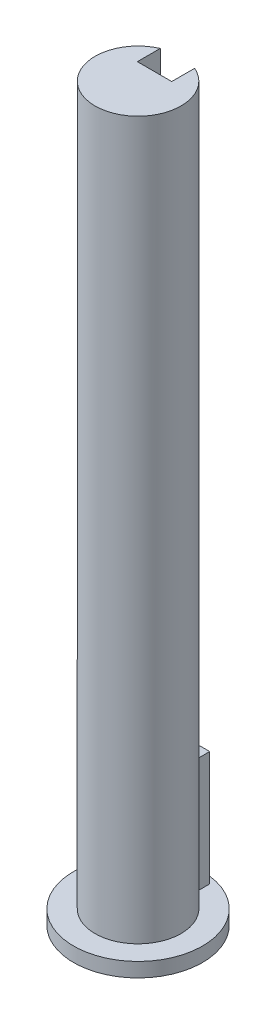
ISO-10303-21;
HEADER;
FILE_DESCRIPTION(('STEP AP214'),'2;1');
FILE_NAME('part.step','',(''),(''),'','','');
FILE_SCHEMA(('AUTOMOTIVE_DESIGN { 1 0 10303 214 1 1 1 1 }'));
ENDSEC;
DATA;
#1=APPLICATION_CONTEXT('core data for automotive mechanical design processes');
#2=APPLICATION_PROTOCOL_DEFINITION('international standard','automotive_design',2000,#1);
#3=PRODUCT_CONTEXT('',#1,'mechanical');
#4=PRODUCT('Part','Part','',(#3));
#5=PRODUCT_RELATED_PRODUCT_CATEGORY('part','',(#4));
#6=PRODUCT_DEFINITION_FORMATION('','',#4);
#7=PRODUCT_DEFINITION_CONTEXT('part definition',#1,'design');
#8=PRODUCT_DEFINITION('design','',#6,#7);
#9=PRODUCT_DEFINITION_SHAPE('','',#8);
#10=(LENGTH_UNIT() NAMED_UNIT(*) SI_UNIT(.MILLI.,.METRE.));
#11=(NAMED_UNIT(*) PLANE_ANGLE_UNIT() SI_UNIT($,.RADIAN.));
#12=(NAMED_UNIT(*) SI_UNIT($,.STERADIAN.) SOLID_ANGLE_UNIT());
#13=UNCERTAINTY_MEASURE_WITH_UNIT(LENGTH_MEASURE(1.E-05),#10,'distance_accuracy_value','');
#14=(GEOMETRIC_REPRESENTATION_CONTEXT(3) GLOBAL_UNCERTAINTY_ASSIGNED_CONTEXT((#13)) GLOBAL_UNIT_ASSIGNED_CONTEXT((#10,
#11,#12)) REPRESENTATION_CONTEXT('',''));
#15=CARTESIAN_POINT('',(0.,0.,0.));
#16=DIRECTION('',(0.,0.,1.));
#17=DIRECTION('',(1.,0.,0.));
#18=AXIS2_PLACEMENT_3D('',#15,#16,#17);
#19=CARTESIAN_POINT('',(0.,50.,0.));
#20=DIRECTION('',(0.,-1.,0.));
#21=DIRECTION('',(0.,0.,-1.));
#22=AXIS2_PLACEMENT_3D('',#19,#20,#21);
#23=CYLINDRICAL_SURFACE('',#22,3.);
#24=CARTESIAN_POINT('',(0.,50.,0.));
#25=DIRECTION('',(0.,1.,0.));
#26=DIRECTION('',(0.,0.,1.));
#27=AXIS2_PLACEMENT_3D('',#24,#25,#26);
#28=CIRCLE('',#27,3.);
#29=CARTESIAN_POINT('',(-1.2,50.,-2.7495454169735));
#30=VERTEX_POINT('',#29);
#31=CARTESIAN_POINT('',(1.2,50.,-2.7495454169735));
#32=VERTEX_POINT('',#31);
#33=EDGE_CURVE('E42',#30,#32,#28,.T.);
#34=ORIENTED_EDGE('',*,*,#33,.F.);
#35=DIRECTION('',(0.,1.,0.));
#36=VECTOR('',#35,1.);
#37=CARTESIAN_POINT('',(-1.2,24.,-2.7495454169735));
#38=LINE('',#37,#36);
#39=CARTESIAN_POINT('',(-1.2,24.,-2.7495454169735));
#40=VERTEX_POINT('',#39);
#41=EDGE_CURVE('E138',#40,#30,#38,.T.);
#42=ORIENTED_EDGE('',*,*,#41,.F.);
#43=CARTESIAN_POINT('',(0.,24.,0.));
#44=DIRECTION('',(0.,-1.,0.));
#45=DIRECTION('',(0.,0.,-1.));
#46=AXIS2_PLACEMENT_3D('',#43,#44,#45);
#47=CIRCLE('',#46,3.);
#48=CARTESIAN_POINT('',(1.2,24.,-2.7495454169735));
#49=VERTEX_POINT('',#48);
#50=EDGE_CURVE('E11',#40,#49,#47,.T.);
#51=ORIENTED_EDGE('',*,*,#50,.T.);
#52=DIRECTION('',(0.,1.,0.));
#53=VECTOR('',#52,1.);
#54=CARTESIAN_POINT('',(1.2,24.,-2.7495454169735));
#55=LINE('',#54,#53);
#56=EDGE_CURVE('E139',#49,#32,#55,.T.);
#57=ORIENTED_EDGE('',*,*,#56,.T.);
#58=EDGE_LOOP('',(#34,#42,#51,#57));
#59=FACE_BOUND('',#58,.T.);
#60=CARTESIAN_POINT('',(0.,0.,0.));
#61=DIRECTION('',(0.,1.,0.));
#62=DIRECTION('',(0.,0.,1.));
#63=AXIS2_PLACEMENT_3D('',#60,#61,#62);
#64=CIRCLE('',#63,3.);
#65=CARTESIAN_POINT('',(-1.,0.,-2.82842712474619));
#66=VERTEX_POINT('',#65);
#67=CARTESIAN_POINT('',(1.,0.,-2.82842712474619));
#68=VERTEX_POINT('',#67);
#69=EDGE_CURVE('E122',#66,#68,#64,.T.);
#70=ORIENTED_EDGE('',*,*,#69,.T.);
#71=DIRECTION('',(0.,-1.,0.));
#72=VECTOR('',#71,1.);
#73=CARTESIAN_POINT('',(1.,8.,-2.82842712474619));
#74=LINE('',#73,#72);
#75=CARTESIAN_POINT('',(1.,8.,-2.82842712474619));
#76=VERTEX_POINT('',#75);
#77=EDGE_CURVE('E130',#76,#68,#74,.T.);
#78=ORIENTED_EDGE('',*,*,#77,.F.);
#79=CARTESIAN_POINT('',(0.,8.,0.));
#80=DIRECTION('',(0.,1.,0.));
#81=DIRECTION('',(0.,0.,1.));
#82=AXIS2_PLACEMENT_3D('',#79,#80,#81);
#83=CIRCLE('',#82,3.);
#84=CARTESIAN_POINT('',(-1.,8.,-2.82842712474619));
#85=VERTEX_POINT('',#84);
#86=EDGE_CURVE('E57',#76,#85,#83,.T.);
#87=ORIENTED_EDGE('',*,*,#86,.T.);
#88=DIRECTION('',(0.,-1.,0.));
#89=VECTOR('',#88,1.);
#90=CARTESIAN_POINT('',(-1.,8.,-2.82842712474619));
#91=LINE('',#90,#89);
#92=EDGE_CURVE('E119',#85,#66,#91,.T.);
#93=ORIENTED_EDGE('',*,*,#92,.T.);
#94=EDGE_LOOP('',(#70,#78,#87,#93));
#95=FACE_BOUND('',#94,.T.);
#96=ADVANCED_FACE('F35',(#59,#95),#23,.T.);
#97=CARTESIAN_POINT('',(0.,50.,0.));
#98=DIRECTION('',(0.,1.,0.));
#99=DIRECTION('',(0.,0.,1.));
#100=AXIS2_PLACEMENT_3D('',#97,#98,#99);
#101=PLANE('',#100);
#102=DIRECTION('',(0.,0.,1.));
#103=VECTOR('',#102,1.);
#104=CARTESIAN_POINT('',(-1.2,50.,-1.1495454169735));
#105=LINE('',#104,#103);
#106=CARTESIAN_POINT('',(-1.2,50.,-1.1495454169735));
#107=VERTEX_POINT('',#106);
#108=EDGE_CURVE('E49',#30,#107,#105,.T.);
#109=ORIENTED_EDGE('',*,*,#108,.F.);
#110=ORIENTED_EDGE('',*,*,#33,.T.);
#111=DIRECTION('',(0.,0.,-1.));
#112=VECTOR('',#111,1.);
#113=CARTESIAN_POINT('',(1.2,50.,-1.1495454169735));
#114=LINE('',#113,#112);
#115=CARTESIAN_POINT('',(1.2,50.,-1.1495454169735));
#116=VERTEX_POINT('',#115);
#117=EDGE_CURVE('E153',#116,#32,#114,.T.);
#118=ORIENTED_EDGE('',*,*,#117,.F.);
#119=DIRECTION('',(1.,0.,0.));
#120=VECTOR('',#119,1.);
#121=CARTESIAN_POINT('',(-1.2,50.,-1.1495454169735));
#122=LINE('',#121,#120);
#123=EDGE_CURVE('E156',#107,#116,#122,.T.);
#124=ORIENTED_EDGE('',*,*,#123,.F.);
#125=EDGE_LOOP('',(#109,#110,#118,#124));
#126=FACE_BOUND('',#125,.T.);
#127=ADVANCED_FACE('F193',(#126),#101,.T.);
#128=CARTESIAN_POINT('',(0.999999999999999,8.,0.));
#129=DIRECTION('',(1.,0.,0.));
#130=DIRECTION('',(0.,0.,-1.));
#131=AXIS2_PLACEMENT_3D('',#128,#129,#130);
#132=PLANE('',#131);
#133=DIRECTION('',(0.,0.,1.));
#134=VECTOR('',#133,1.);
#135=CARTESIAN_POINT('',(0.999999999999999,0.,0.));
#136=LINE('',#135,#134);
#137=CARTESIAN_POINT('',(1.,0.,-4.));
#138=VERTEX_POINT('',#137);
#139=EDGE_CURVE('E110',#138,#68,#136,.T.);
#140=ORIENTED_EDGE('',*,*,#139,.F.);
#141=DIRECTION('',(0.,-1.,0.));
#142=VECTOR('',#141,1.);
#143=CARTESIAN_POINT('',(1.,8.,-4.));
#144=LINE('',#143,#142);
#145=CARTESIAN_POINT('',(1.,8.,-4.));
#146=VERTEX_POINT('',#145);
#147=EDGE_CURVE('E104',#146,#138,#144,.T.);
#148=ORIENTED_EDGE('',*,*,#147,.F.);
#149=DIRECTION('',(0.,0.,1.));
#150=VECTOR('',#149,1.);
#151=CARTESIAN_POINT('',(0.999999999999999,8.,0.));
#152=LINE('',#151,#150);
#153=EDGE_CURVE('E124',#146,#76,#152,.T.);
#154=ORIENTED_EDGE('',*,*,#153,.T.);
#155=ORIENTED_EDGE('',*,*,#77,.T.);
#156=EDGE_LOOP('',(#140,#148,#154,#155));
#157=FACE_BOUND('',#156,.T.);
#158=ADVANCED_FACE('F136',(#157),#132,.T.);
#159=CARTESIAN_POINT('',(0.,8.,-4.));
#160=DIRECTION('',(0.,0.,-1.));
#161=DIRECTION('',(-1.,0.,0.));
#162=AXIS2_PLACEMENT_3D('',#159,#160,#161);
#163=PLANE('',#162);
#164=DIRECTION('',(1.,0.,0.));
#165=VECTOR('',#164,1.);
#166=CARTESIAN_POINT('',(0.,0.,-4.));
#167=LINE('',#166,#165);
#168=CARTESIAN_POINT('',(-1.,0.,-4.));
#169=VERTEX_POINT('',#168);
#170=EDGE_CURVE('E98',#169,#138,#167,.T.);
#171=ORIENTED_EDGE('',*,*,#170,.F.);
#172=DIRECTION('',(0.,-1.,0.));
#173=VECTOR('',#172,1.);
#174=CARTESIAN_POINT('',(-1.,8.,-4.));
#175=LINE('',#174,#173);
#176=CARTESIAN_POINT('',(-1.,8.,-4.));
#177=VERTEX_POINT('',#176);
#178=EDGE_CURVE('E102',#177,#169,#175,.T.);
#179=ORIENTED_EDGE('',*,*,#178,.F.);
#180=DIRECTION('',(1.,0.,0.));
#181=VECTOR('',#180,1.);
#182=CARTESIAN_POINT('',(0.,8.,-4.));
#183=LINE('',#182,#181);
#184=EDGE_CURVE('E143',#177,#146,#183,.T.);
#185=ORIENTED_EDGE('',*,*,#184,.T.);
#186=ORIENTED_EDGE('',*,*,#147,.T.);
#187=EDGE_LOOP('',(#171,#179,#185,#186));
#188=FACE_BOUND('',#187,.T.);
#189=ADVANCED_FACE('F100',(#188),#163,.T.);
#190=CARTESIAN_POINT('',(-1.,8.,0.));
#191=DIRECTION('',(-1.,0.,0.));
#192=DIRECTION('',(0.,0.,1.));
#193=AXIS2_PLACEMENT_3D('',#190,#191,#192);
#194=PLANE('',#193);
#195=DIRECTION('',(0.,0.,-1.));
#196=VECTOR('',#195,1.);
#197=CARTESIAN_POINT('',(-1.,0.,0.));
#198=LINE('',#197,#196);
#199=EDGE_CURVE('E109',#66,#169,#198,.T.);
#200=ORIENTED_EDGE('',*,*,#199,.F.);
#201=ORIENTED_EDGE('',*,*,#92,.F.);
#202=DIRECTION('',(0.,0.,-1.));
#203=VECTOR('',#202,1.);
#204=CARTESIAN_POINT('',(-1.,8.,0.));
#205=LINE('',#204,#203);
#206=EDGE_CURVE('E118',#85,#177,#205,.T.);
#207=ORIENTED_EDGE('',*,*,#206,.T.);
#208=ORIENTED_EDGE('',*,*,#178,.T.);
#209=EDGE_LOOP('',(#200,#201,#207,#208));
#210=FACE_BOUND('',#209,.T.);
#211=ADVANCED_FACE('F115',(#210),#194,.T.);
#212=CARTESIAN_POINT('',(0.,8.,0.));
#213=DIRECTION('',(0.,1.,0.));
#214=DIRECTION('',(0.,0.,1.));
#215=AXIS2_PLACEMENT_3D('',#212,#213,#214);
#216=PLANE('',#215);
#217=ORIENTED_EDGE('',*,*,#86,.F.);
#218=ORIENTED_EDGE('',*,*,#153,.F.);
#219=ORIENTED_EDGE('',*,*,#184,.F.);
#220=ORIENTED_EDGE('',*,*,#206,.F.);
#221=EDGE_LOOP('',(#217,#218,#219,#220));
#222=FACE_BOUND('',#221,.T.);
#223=ADVANCED_FACE('F218',(#222),#216,.T.);
#224=CARTESIAN_POINT('',(0.,24.,0.));
#225=DIRECTION('',(0.,-1.,0.));
#226=DIRECTION('',(0.,0.,-1.));
#227=AXIS2_PLACEMENT_3D('',#224,#225,#226);
#228=PLANE('',#227);
#229=DIRECTION('',(0.,0.,1.));
#230=VECTOR('',#229,1.);
#231=CARTESIAN_POINT('',(-1.2,24.,-1.1495454169735));
#232=LINE('',#231,#230);
#233=CARTESIAN_POINT('',(-1.2,24.,-1.1495454169735));
#234=VERTEX_POINT('',#233);
#235=EDGE_CURVE('E155',#40,#234,#232,.T.);
#236=ORIENTED_EDGE('',*,*,#235,.T.);
#237=DIRECTION('',(1.,0.,0.));
#238=VECTOR('',#237,1.);
#239=CARTESIAN_POINT('',(-1.2,24.,-1.1495454169735));
#240=LINE('',#239,#238);
#241=CARTESIAN_POINT('',(1.2,24.,-1.1495454169735));
#242=VERTEX_POINT('',#241);
#243=EDGE_CURVE('E163',#234,#242,#240,.T.);
#244=ORIENTED_EDGE('',*,*,#243,.T.);
#245=DIRECTION('',(0.,0.,-1.));
#246=VECTOR('',#245,1.);
#247=CARTESIAN_POINT('',(1.2,24.,-1.1495454169735));
#248=LINE('',#247,#246);
#249=EDGE_CURVE('E149',#242,#49,#248,.T.);
#250=ORIENTED_EDGE('',*,*,#249,.T.);
#251=ORIENTED_EDGE('',*,*,#50,.F.);
#252=EDGE_LOOP('',(#236,#244,#250,#251));
#253=FACE_BOUND('',#252,.T.);
#254=ADVANCED_FACE('F208',(#253),#228,.F.);
#255=CARTESIAN_POINT('',(-1.2,24.,-1.1495454169735));
#256=DIRECTION('',(-1.,0.,0.));
#257=DIRECTION('',(0.,0.,1.));
#258=AXIS2_PLACEMENT_3D('',#255,#256,#257);
#259=PLANE('',#258);
#260=ORIENTED_EDGE('',*,*,#108,.T.);
#261=DIRECTION('',(0.,1.,0.));
#262=VECTOR('',#261,1.);
#263=CARTESIAN_POINT('',(-1.2,24.,-1.1495454169735));
#264=LINE('',#263,#262);
#265=EDGE_CURVE('E146',#234,#107,#264,.T.);
#266=ORIENTED_EDGE('',*,*,#265,.F.);
#267=ORIENTED_EDGE('',*,*,#235,.F.);
#268=ORIENTED_EDGE('',*,*,#41,.T.);
#269=EDGE_LOOP('',(#260,#266,#267,#268));
#270=FACE_BOUND('',#269,.T.);
#271=ADVANCED_FACE('F206',(#270),#259,.F.);
#272=CARTESIAN_POINT('',(1.2,24.,-1.1495454169735));
#273=DIRECTION('',(1.,0.,0.));
#274=DIRECTION('',(0.,0.,-1.));
#275=AXIS2_PLACEMENT_3D('',#272,#273,#274);
#276=PLANE('',#275);
#277=ORIENTED_EDGE('',*,*,#117,.T.);
#278=ORIENTED_EDGE('',*,*,#56,.F.);
#279=ORIENTED_EDGE('',*,*,#249,.F.);
#280=DIRECTION('',(0.,1.,0.));
#281=VECTOR('',#280,1.);
#282=CARTESIAN_POINT('',(1.2,24.,-1.1495454169735));
#283=LINE('',#282,#281);
#284=EDGE_CURVE('E148',#242,#116,#283,.T.);
#285=ORIENTED_EDGE('',*,*,#284,.T.);
#286=EDGE_LOOP('',(#277,#278,#279,#285));
#287=FACE_BOUND('',#286,.T.);
#288=ADVANCED_FACE('F188',(#287),#276,.F.);
#289=CARTESIAN_POINT('',(-1.2,24.,-1.1495454169735));
#290=DIRECTION('',(0.,0.,1.));
#291=DIRECTION('',(1.,0.,0.));
#292=AXIS2_PLACEMENT_3D('',#289,#290,#291);
#293=PLANE('',#292);
#294=ORIENTED_EDGE('',*,*,#123,.T.);
#295=ORIENTED_EDGE('',*,*,#284,.F.);
#296=ORIENTED_EDGE('',*,*,#243,.F.);
#297=ORIENTED_EDGE('',*,*,#265,.T.);
#298=EDGE_LOOP('',(#294,#295,#296,#297));
#299=FACE_BOUND('',#298,.T.);
#300=ADVANCED_FACE('F183',(#299),#293,.F.);
#301=CARTESIAN_POINT('',(0.,0.,0.));
#302=DIRECTION('',(0.,-1.,0.));
#303=DIRECTION('',(0.,0.,-1.));
#304=AXIS2_PLACEMENT_3D('',#301,#302,#303);
#305=PLANE('',#304);
#306=CARTESIAN_POINT('',(0.,0.,0.));
#307=DIRECTION('',(0.,-1.,0.));
#308=DIRECTION('',(0.,0.,-1.));
#309=AXIS2_PLACEMENT_3D('',#306,#307,#308);
#310=CIRCLE('',#309,4.5);
#311=CARTESIAN_POINT('',(0.,0.,-4.5));
#312=VERTEX_POINT('',#311);
#313=EDGE_CURVE('E168',#312,#312,#310,.T.);
#314=ORIENTED_EDGE('',*,*,#313,.F.);
#315=EDGE_LOOP('',(#314));
#316=FACE_BOUND('',#315,.T.);
#317=ORIENTED_EDGE('',*,*,#139,.T.);
#318=ORIENTED_EDGE('',*,*,#69,.F.);
#319=ORIENTED_EDGE('',*,*,#199,.T.);
#320=ORIENTED_EDGE('',*,*,#170,.T.);
#321=EDGE_LOOP('',(#317,#318,#319,#320));
#322=FACE_BOUND('',#321,.T.);
#323=ADVANCED_FACE('F121',(#316,#322),#305,.F.);
#324=CARTESIAN_POINT('',(0.,-1.,0.));
#325=DIRECTION('',(0.,1.,0.));
#326=DIRECTION('',(0.,0.,1.));
#327=AXIS2_PLACEMENT_3D('',#324,#325,#326);
#328=CYLINDRICAL_SURFACE('',#327,4.5);
#329=CARTESIAN_POINT('',(0.,-1.,0.));
#330=DIRECTION('',(0.,-1.,0.));
#331=DIRECTION('',(0.,0.,-1.));
#332=AXIS2_PLACEMENT_3D('',#329,#330,#331);
#333=CIRCLE('',#332,4.5);
#334=CARTESIAN_POINT('',(0.,-1.,-4.5));
#335=VERTEX_POINT('',#334);
#336=EDGE_CURVE('E160',#335,#335,#333,.T.);
#337=ORIENTED_EDGE('',*,*,#336,.F.);
#338=EDGE_LOOP('',(#337));
#339=FACE_BOUND('',#338,.T.);
#340=ORIENTED_EDGE('',*,*,#313,.T.);
#341=EDGE_LOOP('',(#340));
#342=FACE_BOUND('',#341,.T.);
#343=ADVANCED_FACE('F176',(#339,#342),#328,.T.);
#344=CARTESIAN_POINT('',(0.,-1.,0.));
#345=DIRECTION('',(0.,-1.,0.));
#346=DIRECTION('',(0.,0.,-1.));
#347=AXIS2_PLACEMENT_3D('',#344,#345,#346);
#348=PLANE('',#347);
#349=ORIENTED_EDGE('',*,*,#336,.T.);
#350=EDGE_LOOP('',(#349));
#351=FACE_BOUND('',#350,.T.);
#352=ADVANCED_FACE('F174',(#351),#348,.T.);
#353=CLOSED_SHELL('',(#96,#127,#158,#189,#211,#223,#254,#271,#288,#300,#323,#343,#352));
#354=MANIFOLD_SOLID_BREP('B2',#353);
#355=ADVANCED_BREP_SHAPE_REPRESENTATION('',(#18,#354),#14);
#356=SHAPE_DEFINITION_REPRESENTATION(#9,#355);
ENDSEC;
END-ISO-10303-21;
